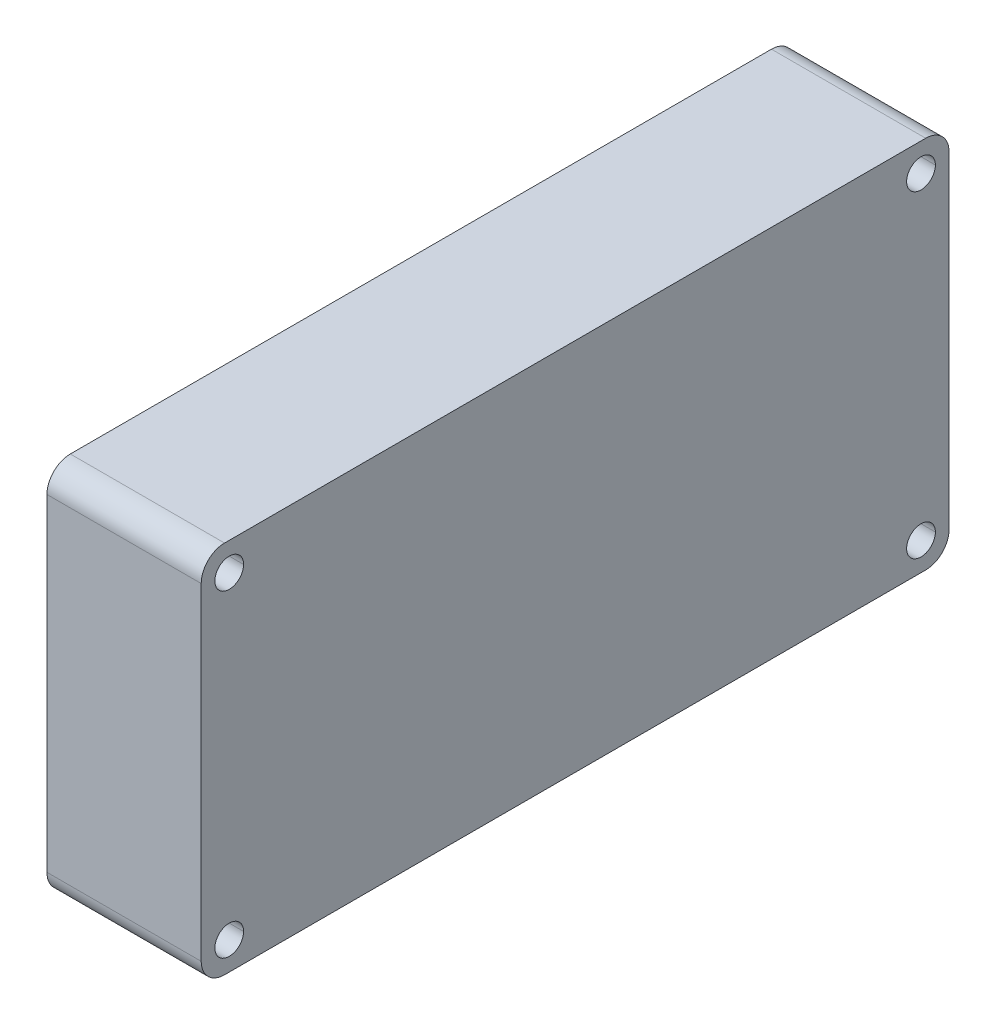
ISO-10303-21;
HEADER;
FILE_DESCRIPTION(('STEP AP214'),'2;1');
FILE_NAME('part.step','',(''),(''),'','','');
FILE_SCHEMA(('AUTOMOTIVE_DESIGN { 1 0 10303 214 1 1 1 1 }'));
ENDSEC;
DATA;
#1=APPLICATION_CONTEXT('core data for automotive mechanical design processes');
#2=APPLICATION_PROTOCOL_DEFINITION('international standard','automotive_design',2000,#1);
#3=PRODUCT_CONTEXT('',#1,'mechanical');
#4=PRODUCT('Part','Part','',(#3));
#5=PRODUCT_RELATED_PRODUCT_CATEGORY('part','',(#4));
#6=PRODUCT_DEFINITION_FORMATION('','',#4);
#7=PRODUCT_DEFINITION_CONTEXT('part definition',#1,'design');
#8=PRODUCT_DEFINITION('design','',#6,#7);
#9=PRODUCT_DEFINITION_SHAPE('','',#8);
#10=(LENGTH_UNIT() NAMED_UNIT(*) SI_UNIT(.MILLI.,.METRE.));
#11=(NAMED_UNIT(*) PLANE_ANGLE_UNIT() SI_UNIT($,.RADIAN.));
#12=(NAMED_UNIT(*) SI_UNIT($,.STERADIAN.) SOLID_ANGLE_UNIT());
#13=UNCERTAINTY_MEASURE_WITH_UNIT(LENGTH_MEASURE(1.E-05),#10,'distance_accuracy_value','');
#14=(GEOMETRIC_REPRESENTATION_CONTEXT(3) GLOBAL_UNCERTAINTY_ASSIGNED_CONTEXT((#13)) GLOBAL_UNIT_ASSIGNED_CONTEXT((#10,
#11,#12)) REPRESENTATION_CONTEXT('',''));
#15=CARTESIAN_POINT('',(0.,0.,0.));
#16=DIRECTION('',(0.,0.,1.));
#17=DIRECTION('',(1.,0.,0.));
#18=AXIS2_PLACEMENT_3D('',#15,#16,#17);
#19=CARTESIAN_POINT('',(0.,33.9999999999996,74.));
#20=DIRECTION('',(1.,0.,0.));
#21=DIRECTION('',(0.,0.,-1.));
#22=AXIS2_PLACEMENT_3D('',#19,#20,#21);
#23=CYLINDRICAL_SURFACE('',#22,3.075);
#24=DIRECTION('',(1.,0.,0.));
#25=VECTOR('',#24,1.);
#26=CARTESIAN_POINT('',(0.,33.9999999999996,77.075));
#27=LINE('',#26,#25);
#28=CARTESIAN_POINT('',(0.,33.9999999999996,77.075));
#29=VERTEX_POINT('',#28);
#30=CARTESIAN_POINT('',(33.,33.9999999999996,77.075));
#31=VERTEX_POINT('',#30);
#32=EDGE_CURVE('E147',#29,#31,#27,.T.);
#33=ORIENTED_EDGE('',*,*,#32,.F.);
#34=CARTESIAN_POINT('',(0.,33.9999999999996,74.));
#35=DIRECTION('',(1.,0.,0.));
#36=DIRECTION('',(0.,0.,1.));
#37=AXIS2_PLACEMENT_3D('',#34,#35,#36);
#38=CIRCLE('',#37,3.075);
#39=CARTESIAN_POINT('',(0.,33.9999999999996,70.925));
#40=VERTEX_POINT('',#39);
#41=EDGE_CURVE('E142',#40,#29,#38,.T.);
#42=ORIENTED_EDGE('',*,*,#41,.F.);
#43=DIRECTION('',(1.,0.,0.));
#44=VECTOR('',#43,1.);
#45=CARTESIAN_POINT('',(0.,33.9999999999996,70.925));
#46=LINE('',#45,#44);
#47=CARTESIAN_POINT('',(33.,33.9999999999996,70.925));
#48=VERTEX_POINT('',#47);
#49=EDGE_CURVE('E144',#40,#48,#46,.T.);
#50=ORIENTED_EDGE('',*,*,#49,.T.);
#51=CARTESIAN_POINT('',(33.,33.9999999999996,74.));
#52=DIRECTION('',(1.,0.,0.));
#53=DIRECTION('',(0.,0.,1.));
#54=AXIS2_PLACEMENT_3D('',#51,#52,#53);
#55=CIRCLE('',#54,3.075);
#56=EDGE_CURVE('E242',#48,#31,#55,.T.);
#57=ORIENTED_EDGE('',*,*,#56,.T.);
#58=EDGE_LOOP('',(#33,#42,#50,#57));
#59=FACE_BOUND('',#58,.T.);
#60=ADVANCED_FACE('F17',(#59),#23,.F.);
#61=CARTESIAN_POINT('',(0.,-34.,-74.));
#62=DIRECTION('',(1.,0.,0.));
#63=DIRECTION('',(0.,0.,-1.));
#64=AXIS2_PLACEMENT_3D('',#61,#62,#63);
#65=CYLINDRICAL_SURFACE('',#64,3.075);
#66=DIRECTION('',(1.,0.,0.));
#67=VECTOR('',#66,1.);
#68=CARTESIAN_POINT('',(0.,-34.,-70.925));
#69=LINE('',#68,#67);
#70=CARTESIAN_POINT('',(0.,-34.,-70.925));
#71=VERTEX_POINT('',#70);
#72=CARTESIAN_POINT('',(33.,-34.,-70.925));
#73=VERTEX_POINT('',#72);
#74=EDGE_CURVE('E227',#71,#73,#69,.T.);
#75=ORIENTED_EDGE('',*,*,#74,.F.);
#76=CARTESIAN_POINT('',(0.,-34.,-74.));
#77=DIRECTION('',(1.,0.,0.));
#78=DIRECTION('',(0.,0.,1.));
#79=AXIS2_PLACEMENT_3D('',#76,#77,#78);
#80=CIRCLE('',#79,3.075);
#81=CARTESIAN_POINT('',(0.,-34.,-77.075));
#82=VERTEX_POINT('',#81);
#83=EDGE_CURVE('E152',#82,#71,#80,.T.);
#84=ORIENTED_EDGE('',*,*,#83,.F.);
#85=DIRECTION('',(1.,0.,0.));
#86=VECTOR('',#85,1.);
#87=CARTESIAN_POINT('',(0.,-34.,-77.075));
#88=LINE('',#87,#86);
#89=CARTESIAN_POINT('',(33.,-34.,-77.075));
#90=VERTEX_POINT('',#89);
#91=EDGE_CURVE('E202',#82,#90,#88,.T.);
#92=ORIENTED_EDGE('',*,*,#91,.T.);
#93=CARTESIAN_POINT('',(33.,-34.,-74.));
#94=DIRECTION('',(1.,0.,0.));
#95=DIRECTION('',(0.,0.,1.));
#96=AXIS2_PLACEMENT_3D('',#93,#94,#95);
#97=CIRCLE('',#96,3.075);
#98=EDGE_CURVE('E219',#90,#73,#97,.T.);
#99=ORIENTED_EDGE('',*,*,#98,.T.);
#100=EDGE_LOOP('',(#75,#84,#92,#99));
#101=FACE_BOUND('',#100,.T.);
#102=ADVANCED_FACE('F264',(#101),#65,.F.);
#103=CARTESIAN_POINT('',(0.,-33.9999999999996,74.));
#104=DIRECTION('',(1.,0.,0.));
#105=DIRECTION('',(0.,0.,-1.));
#106=AXIS2_PLACEMENT_3D('',#103,#104,#105);
#107=CYLINDRICAL_SURFACE('',#106,3.075);
#108=DIRECTION('',(1.,0.,0.));
#109=VECTOR('',#108,1.);
#110=CARTESIAN_POINT('',(0.,-33.9999999999996,77.075));
#111=LINE('',#110,#109);
#112=CARTESIAN_POINT('',(0.,-33.9999999999996,77.075));
#113=VERTEX_POINT('',#112);
#114=CARTESIAN_POINT('',(33.,-33.9999999999996,77.075));
#115=VERTEX_POINT('',#114);
#116=EDGE_CURVE('E201',#113,#115,#111,.T.);
#117=ORIENTED_EDGE('',*,*,#116,.F.);
#118=CARTESIAN_POINT('',(0.,-33.9999999999996,74.));
#119=DIRECTION('',(1.,0.,0.));
#120=DIRECTION('',(0.,0.,-1.));
#121=AXIS2_PLACEMENT_3D('',#118,#119,#120);
#122=CIRCLE('',#121,3.075);
#123=CARTESIAN_POINT('',(0.,-33.9999999999996,70.925));
#124=VERTEX_POINT('',#123);
#125=EDGE_CURVE('E196',#124,#113,#122,.T.);
#126=ORIENTED_EDGE('',*,*,#125,.F.);
#127=DIRECTION('',(1.,0.,0.));
#128=VECTOR('',#127,1.);
#129=CARTESIAN_POINT('',(0.,-33.9999999999996,70.925));
#130=LINE('',#129,#128);
#131=CARTESIAN_POINT('',(33.,-33.9999999999996,70.925));
#132=VERTEX_POINT('',#131);
#133=EDGE_CURVE('E188',#124,#132,#130,.T.);
#134=ORIENTED_EDGE('',*,*,#133,.T.);
#135=CARTESIAN_POINT('',(33.,-33.9999999999996,74.));
#136=DIRECTION('',(1.,0.,0.));
#137=DIRECTION('',(0.,0.,-1.));
#138=AXIS2_PLACEMENT_3D('',#135,#136,#137);
#139=CIRCLE('',#138,3.075);
#140=EDGE_CURVE('E215',#132,#115,#139,.T.);
#141=ORIENTED_EDGE('',*,*,#140,.T.);
#142=EDGE_LOOP('',(#117,#126,#134,#141));
#143=FACE_BOUND('',#142,.T.);
#144=ADVANCED_FACE('F592',(#143),#107,.F.);
#145=CARTESIAN_POINT('',(0.,34.,-74.));
#146=DIRECTION('',(1.,0.,0.));
#147=DIRECTION('',(0.,0.,-1.));
#148=AXIS2_PLACEMENT_3D('',#145,#146,#147);
#149=CYLINDRICAL_SURFACE('',#148,3.075);
#150=DIRECTION('',(1.,0.,0.));
#151=VECTOR('',#150,1.);
#152=CARTESIAN_POINT('',(0.,34.,-70.925));
#153=LINE('',#152,#151);
#154=CARTESIAN_POINT('',(0.,34.,-70.925));
#155=VERTEX_POINT('',#154);
#156=CARTESIAN_POINT('',(33.,34.,-70.925));
#157=VERTEX_POINT('',#156);
#158=EDGE_CURVE('E253',#155,#157,#153,.T.);
#159=ORIENTED_EDGE('',*,*,#158,.F.);
#160=CARTESIAN_POINT('',(0.,34.,-74.));
#161=DIRECTION('',(1.,0.,0.));
#162=DIRECTION('',(0.,0.,-1.));
#163=AXIS2_PLACEMENT_3D('',#160,#161,#162);
#164=CIRCLE('',#163,3.075);
#165=CARTESIAN_POINT('',(0.,34.,-77.075));
#166=VERTEX_POINT('',#165);
#167=EDGE_CURVE('E214',#166,#155,#164,.T.);
#168=ORIENTED_EDGE('',*,*,#167,.F.);
#169=DIRECTION('',(1.,0.,0.));
#170=VECTOR('',#169,1.);
#171=CARTESIAN_POINT('',(0.,34.,-77.075));
#172=LINE('',#171,#170);
#173=CARTESIAN_POINT('',(33.,34.,-77.075));
#174=VERTEX_POINT('',#173);
#175=EDGE_CURVE('E182',#166,#174,#172,.T.);
#176=ORIENTED_EDGE('',*,*,#175,.T.);
#177=CARTESIAN_POINT('',(33.,34.,-74.));
#178=DIRECTION('',(1.,0.,0.));
#179=DIRECTION('',(0.,0.,-1.));
#180=AXIS2_PLACEMENT_3D('',#177,#178,#179);
#181=CIRCLE('',#180,3.075);
#182=EDGE_CURVE('E218',#174,#157,#181,.T.);
#183=ORIENTED_EDGE('',*,*,#182,.T.);
#184=EDGE_LOOP('',(#159,#168,#176,#183));
#185=FACE_BOUND('',#184,.T.);
#186=ADVANCED_FACE('F624',(#185),#149,.F.);
#187=CARTESIAN_POINT('',(33.,-35.,80.));
#188=DIRECTION('',(0.,0.,-1.));
#189=DIRECTION('',(0.,-1.,0.));
#190=AXIS2_PLACEMENT_3D('',#187,#188,#189);
#191=PLANE('',#190);
#192=DIRECTION('',(0.,-1.,0.));
#193=VECTOR('',#192,1.);
#194=CARTESIAN_POINT('',(0.,-35.,80.));
#195=LINE('',#194,#193);
#196=CARTESIAN_POINT('',(0.,35.,80.));
#197=VERTEX_POINT('',#196);
#198=CARTESIAN_POINT('',(0.,-35.,80.));
#199=VERTEX_POINT('',#198);
#200=EDGE_CURVE('E223',#197,#199,#195,.T.);
#201=ORIENTED_EDGE('',*,*,#200,.T.);
#202=DIRECTION('',(-1.,0.,0.));
#203=VECTOR('',#202,1.);
#204=CARTESIAN_POINT('',(33.,-35.,80.));
#205=LINE('',#204,#203);
#206=CARTESIAN_POINT('',(33.,-35.,80.));
#207=VERTEX_POINT('',#206);
#208=EDGE_CURVE('E213',#207,#199,#205,.T.);
#209=ORIENTED_EDGE('',*,*,#208,.F.);
#210=DIRECTION('',(0.,-1.,0.));
#211=VECTOR('',#210,1.);
#212=CARTESIAN_POINT('',(33.,-35.,80.));
#213=LINE('',#212,#211);
#214=CARTESIAN_POINT('',(33.,35.,80.));
#215=VERTEX_POINT('',#214);
#216=EDGE_CURVE('E245',#215,#207,#213,.T.);
#217=ORIENTED_EDGE('',*,*,#216,.F.);
#218=DIRECTION('',(-1.,0.,0.));
#219=VECTOR('',#218,1.);
#220=CARTESIAN_POINT('',(33.,35.,80.));
#221=LINE('',#220,#219);
#222=EDGE_CURVE('E11',#215,#197,#221,.T.);
#223=ORIENTED_EDGE('',*,*,#222,.T.);
#224=EDGE_LOOP('',(#201,#209,#217,#223));
#225=FACE_BOUND('',#224,.T.);
#226=ADVANCED_FACE('F620',(#225),#191,.F.);
#227=CARTESIAN_POINT('',(33.,35.,75.));
#228=DIRECTION('',(-1.,0.,0.));
#229=DIRECTION('',(0.,0.,1.));
#230=AXIS2_PLACEMENT_3D('',#227,#228,#229);
#231=CYLINDRICAL_SURFACE('',#230,5.);
#232=CARTESIAN_POINT('',(0.,35.,75.));
#233=DIRECTION('',(1.,0.,0.));
#234=DIRECTION('',(0.,0.,1.));
#235=AXIS2_PLACEMENT_3D('',#232,#233,#234);
#236=CIRCLE('',#235,5.);
#237=CARTESIAN_POINT('',(0.,40.,75.));
#238=VERTEX_POINT('',#237);
#239=EDGE_CURVE('E181',#238,#197,#236,.T.);
#240=ORIENTED_EDGE('',*,*,#239,.T.);
#241=ORIENTED_EDGE('',*,*,#222,.F.);
#242=CARTESIAN_POINT('',(33.,35.,75.));
#243=DIRECTION('',(1.,0.,0.));
#244=DIRECTION('',(0.,0.,1.));
#245=AXIS2_PLACEMENT_3D('',#242,#243,#244);
#246=CIRCLE('',#245,5.);
#247=CARTESIAN_POINT('',(33.,40.,75.));
#248=VERTEX_POINT('',#247);
#249=EDGE_CURVE('E246',#248,#215,#246,.T.);
#250=ORIENTED_EDGE('',*,*,#249,.F.);
#251=DIRECTION('',(-1.,0.,0.));
#252=VECTOR('',#251,1.);
#253=CARTESIAN_POINT('',(33.,40.,75.));
#254=LINE('',#253,#252);
#255=EDGE_CURVE('E28',#248,#238,#254,.T.);
#256=ORIENTED_EDGE('',*,*,#255,.T.);
#257=EDGE_LOOP('',(#240,#241,#250,#256));
#258=FACE_BOUND('',#257,.T.);
#259=ADVANCED_FACE('F352',(#258),#231,.T.);
#260=CARTESIAN_POINT('',(33.,40.,75.));
#261=DIRECTION('',(0.,-1.,0.));
#262=DIRECTION('',(0.,0.,-1.));
#263=AXIS2_PLACEMENT_3D('',#260,#261,#262);
#264=PLANE('',#263);
#265=DIRECTION('',(0.,0.,1.));
#266=VECTOR('',#265,1.);
#267=CARTESIAN_POINT('',(0.,40.,75.));
#268=LINE('',#267,#266);
#269=CARTESIAN_POINT('',(0.,40.,-75.));
#270=VERTEX_POINT('',#269);
#271=EDGE_CURVE('E176',#270,#238,#268,.T.);
#272=ORIENTED_EDGE('',*,*,#271,.T.);
#273=ORIENTED_EDGE('',*,*,#255,.F.);
#274=DIRECTION('',(0.,0.,1.));
#275=VECTOR('',#274,1.);
#276=CARTESIAN_POINT('',(33.,40.,75.));
#277=LINE('',#276,#275);
#278=CARTESIAN_POINT('',(33.,40.,-75.));
#279=VERTEX_POINT('',#278);
#280=EDGE_CURVE('E21',#279,#248,#277,.T.);
#281=ORIENTED_EDGE('',*,*,#280,.F.);
#282=DIRECTION('',(-1.,0.,0.));
#283=VECTOR('',#282,1.);
#284=CARTESIAN_POINT('',(33.,40.,-75.));
#285=LINE('',#284,#283);
#286=EDGE_CURVE('E328',#279,#270,#285,.T.);
#287=ORIENTED_EDGE('',*,*,#286,.T.);
#288=EDGE_LOOP('',(#272,#273,#281,#287));
#289=FACE_BOUND('',#288,.T.);
#290=ADVANCED_FACE('F338',(#289),#264,.F.);
#291=CARTESIAN_POINT('',(33.,35.,-75.));
#292=DIRECTION('',(-1.,0.,0.));
#293=DIRECTION('',(0.,0.,1.));
#294=AXIS2_PLACEMENT_3D('',#291,#292,#293);
#295=CYLINDRICAL_SURFACE('',#294,5.);
#296=CARTESIAN_POINT('',(0.,35.,-75.));
#297=DIRECTION('',(1.,0.,0.));
#298=DIRECTION('',(0.,0.,1.));
#299=AXIS2_PLACEMENT_3D('',#296,#297,#298);
#300=CIRCLE('',#299,5.);
#301=CARTESIAN_POINT('',(0.,35.,-80.));
#302=VERTEX_POINT('',#301);
#303=EDGE_CURVE('E180',#302,#270,#300,.T.);
#304=ORIENTED_EDGE('',*,*,#303,.T.);
#305=ORIENTED_EDGE('',*,*,#286,.F.);
#306=CARTESIAN_POINT('',(33.,35.,-75.));
#307=DIRECTION('',(1.,0.,0.));
#308=DIRECTION('',(0.,0.,1.));
#309=AXIS2_PLACEMENT_3D('',#306,#307,#308);
#310=CIRCLE('',#309,5.);
#311=CARTESIAN_POINT('',(33.,35.,-80.));
#312=VERTEX_POINT('',#311);
#313=EDGE_CURVE('E305',#312,#279,#310,.T.);
#314=ORIENTED_EDGE('',*,*,#313,.F.);
#315=DIRECTION('',(-1.,0.,0.));
#316=VECTOR('',#315,1.);
#317=CARTESIAN_POINT('',(33.,35.,-80.));
#318=LINE('',#317,#316);
#319=EDGE_CURVE('E324',#312,#302,#318,.T.);
#320=ORIENTED_EDGE('',*,*,#319,.T.);
#321=EDGE_LOOP('',(#304,#305,#314,#320));
#322=FACE_BOUND('',#321,.T.);
#323=ADVANCED_FACE('F345',(#322),#295,.T.);
#324=CARTESIAN_POINT('',(33.,-35.,-80.));
#325=DIRECTION('',(0.,0.,1.));
#326=DIRECTION('',(1.,0.,0.));
#327=AXIS2_PLACEMENT_3D('',#324,#325,#326);
#328=PLANE('',#327);
#329=DIRECTION('',(0.,1.,0.));
#330=VECTOR('',#329,1.);
#331=CARTESIAN_POINT('',(0.,-35.,-80.));
#332=LINE('',#331,#330);
#333=CARTESIAN_POINT('',(0.,-35.,-80.));
#334=VERTEX_POINT('',#333);
#335=EDGE_CURVE('E206',#334,#302,#332,.T.);
#336=ORIENTED_EDGE('',*,*,#335,.T.);
#337=ORIENTED_EDGE('',*,*,#319,.F.);
#338=DIRECTION('',(0.,1.,0.));
#339=VECTOR('',#338,1.);
#340=CARTESIAN_POINT('',(33.,-35.,-80.));
#341=LINE('',#340,#339);
#342=CARTESIAN_POINT('',(33.,-35.,-80.));
#343=VERTEX_POINT('',#342);
#344=EDGE_CURVE('E309',#343,#312,#341,.T.);
#345=ORIENTED_EDGE('',*,*,#344,.F.);
#346=DIRECTION('',(-1.,0.,0.));
#347=VECTOR('',#346,1.);
#348=CARTESIAN_POINT('',(33.,-35.,-80.));
#349=LINE('',#348,#347);
#350=EDGE_CURVE('E321',#343,#334,#349,.T.);
#351=ORIENTED_EDGE('',*,*,#350,.T.);
#352=EDGE_LOOP('',(#336,#337,#345,#351));
#353=FACE_BOUND('',#352,.T.);
#354=ADVANCED_FACE('F633',(#353),#328,.F.);
#355=CARTESIAN_POINT('',(33.,-35.,-75.));
#356=DIRECTION('',(-1.,0.,0.));
#357=DIRECTION('',(0.,0.,1.));
#358=AXIS2_PLACEMENT_3D('',#355,#356,#357);
#359=CYLINDRICAL_SURFACE('',#358,5.);
#360=CARTESIAN_POINT('',(0.,-35.,-75.));
#361=DIRECTION('',(1.,0.,0.));
#362=DIRECTION('',(0.,0.,-1.));
#363=AXIS2_PLACEMENT_3D('',#360,#361,#362);
#364=CIRCLE('',#363,5.);
#365=CARTESIAN_POINT('',(0.,-40.,-75.));
#366=VERTEX_POINT('',#365);
#367=EDGE_CURVE('E209',#366,#334,#364,.T.);
#368=ORIENTED_EDGE('',*,*,#367,.T.);
#369=ORIENTED_EDGE('',*,*,#350,.F.);
#370=CARTESIAN_POINT('',(33.,-35.,-75.));
#371=DIRECTION('',(1.,0.,0.));
#372=DIRECTION('',(0.,0.,-1.));
#373=AXIS2_PLACEMENT_3D('',#370,#371,#372);
#374=CIRCLE('',#373,5.);
#375=CARTESIAN_POINT('',(33.,-40.,-75.));
#376=VERTEX_POINT('',#375);
#377=EDGE_CURVE('E174',#376,#343,#374,.T.);
#378=ORIENTED_EDGE('',*,*,#377,.F.);
#379=DIRECTION('',(-1.,0.,0.));
#380=VECTOR('',#379,1.);
#381=CARTESIAN_POINT('',(33.,-40.,-75.));
#382=LINE('',#381,#380);
#383=EDGE_CURVE('E43',#376,#366,#382,.T.);
#384=ORIENTED_EDGE('',*,*,#383,.T.);
#385=EDGE_LOOP('',(#368,#369,#378,#384));
#386=FACE_BOUND('',#385,.T.);
#387=ADVANCED_FACE('F583',(#386),#359,.T.);
#388=CARTESIAN_POINT('',(33.,-40.,75.));
#389=DIRECTION('',(0.,1.,0.));
#390=DIRECTION('',(1.,0.,0.));
#391=AXIS2_PLACEMENT_3D('',#388,#389,#390);
#392=PLANE('',#391);
#393=DIRECTION('',(0.,0.,-1.));
#394=VECTOR('',#393,1.);
#395=CARTESIAN_POINT('',(0.,-40.,75.));
#396=LINE('',#395,#394);
#397=CARTESIAN_POINT('',(0.,-40.,75.));
#398=VERTEX_POINT('',#397);
#399=EDGE_CURVE('E153',#398,#366,#396,.T.);
#400=ORIENTED_EDGE('',*,*,#399,.T.);
#401=ORIENTED_EDGE('',*,*,#383,.F.);
#402=DIRECTION('',(0.,0.,-1.));
#403=VECTOR('',#402,1.);
#404=CARTESIAN_POINT('',(33.,-40.,75.));
#405=LINE('',#404,#403);
#406=CARTESIAN_POINT('',(33.,-40.,75.));
#407=VERTEX_POINT('',#406);
#408=EDGE_CURVE('E292',#407,#376,#405,.T.);
#409=ORIENTED_EDGE('',*,*,#408,.F.);
#410=DIRECTION('',(-1.,0.,0.));
#411=VECTOR('',#410,1.);
#412=CARTESIAN_POINT('',(33.,-40.,75.));
#413=LINE('',#412,#411);
#414=EDGE_CURVE('E210',#407,#398,#413,.T.);
#415=ORIENTED_EDGE('',*,*,#414,.T.);
#416=EDGE_LOOP('',(#400,#401,#409,#415));
#417=FACE_BOUND('',#416,.T.);
#418=ADVANCED_FACE('F578',(#417),#392,.F.);
#419=CARTESIAN_POINT('',(33.,-35.,75.));
#420=DIRECTION('',(-1.,0.,0.));
#421=DIRECTION('',(0.,0.,1.));
#422=AXIS2_PLACEMENT_3D('',#419,#420,#421);
#423=CYLINDRICAL_SURFACE('',#422,5.);
#424=CARTESIAN_POINT('',(0.,-35.,75.));
#425=DIRECTION('',(1.,0.,0.));
#426=DIRECTION('',(0.,0.,1.));
#427=AXIS2_PLACEMENT_3D('',#424,#425,#426);
#428=CIRCLE('',#427,5.);
#429=EDGE_CURVE('E296',#199,#398,#428,.T.);
#430=ORIENTED_EDGE('',*,*,#429,.T.);
#431=ORIENTED_EDGE('',*,*,#414,.F.);
#432=CARTESIAN_POINT('',(33.,-35.,75.));
#433=DIRECTION('',(1.,0.,0.));
#434=DIRECTION('',(0.,0.,1.));
#435=AXIS2_PLACEMENT_3D('',#432,#433,#434);
#436=CIRCLE('',#435,5.);
#437=EDGE_CURVE('E186',#207,#407,#436,.T.);
#438=ORIENTED_EDGE('',*,*,#437,.F.);
#439=ORIENTED_EDGE('',*,*,#208,.T.);
#440=EDGE_LOOP('',(#430,#431,#438,#439));
#441=FACE_BOUND('',#440,.T.);
#442=ADVANCED_FACE('F582',(#441),#423,.T.);
#443=CARTESIAN_POINT('',(0.,-35.,75.));
#444=DIRECTION('',(-1.,0.,0.));
#445=DIRECTION('',(0.,0.,1.));
#446=AXIS2_PLACEMENT_3D('',#443,#444,#445);
#447=PLANE('',#446);
#448=ORIENTED_EDGE('',*,*,#167,.T.);
#449=CARTESIAN_POINT('',(0.,34.,-74.));
#450=DIRECTION('',(1.,0.,0.));
#451=DIRECTION('',(0.,0.,-1.));
#452=AXIS2_PLACEMENT_3D('',#449,#450,#451);
#453=CIRCLE('',#452,3.075);
#454=EDGE_CURVE('E191',#155,#166,#453,.T.);
#455=ORIENTED_EDGE('',*,*,#454,.T.);
#456=EDGE_LOOP('',(#448,#455));
#457=FACE_BOUND('',#456,.T.);
#458=ORIENTED_EDGE('',*,*,#125,.T.);
#459=CARTESIAN_POINT('',(0.,-33.9999999999996,74.));
#460=DIRECTION('',(1.,0.,0.));
#461=DIRECTION('',(0.,0.,-1.));
#462=AXIS2_PLACEMENT_3D('',#459,#460,#461);
#463=CIRCLE('',#462,3.075);
#464=EDGE_CURVE('E197',#113,#124,#463,.T.);
#465=ORIENTED_EDGE('',*,*,#464,.T.);
#466=EDGE_LOOP('',(#458,#465));
#467=FACE_BOUND('',#466,.T.);
#468=ORIENTED_EDGE('',*,*,#83,.T.);
#469=CARTESIAN_POINT('',(0.,-34.,-74.));
#470=DIRECTION('',(1.,0.,0.));
#471=DIRECTION('',(0.,0.,1.));
#472=AXIS2_PLACEMENT_3D('',#469,#470,#471);
#473=CIRCLE('',#472,3.075);
#474=EDGE_CURVE('E161',#71,#82,#473,.T.);
#475=ORIENTED_EDGE('',*,*,#474,.T.);
#476=EDGE_LOOP('',(#468,#475));
#477=FACE_BOUND('',#476,.T.);
#478=ORIENTED_EDGE('',*,*,#41,.T.);
#479=CARTESIAN_POINT('',(0.,33.9999999999996,74.));
#480=DIRECTION('',(1.,0.,0.));
#481=DIRECTION('',(0.,0.,1.));
#482=AXIS2_PLACEMENT_3D('',#479,#480,#481);
#483=CIRCLE('',#482,3.075);
#484=EDGE_CURVE('E157',#29,#40,#483,.T.);
#485=ORIENTED_EDGE('',*,*,#484,.T.);
#486=EDGE_LOOP('',(#478,#485));
#487=FACE_BOUND('',#486,.T.);
#488=ORIENTED_EDGE('',*,*,#429,.F.);
#489=ORIENTED_EDGE('',*,*,#200,.F.);
#490=ORIENTED_EDGE('',*,*,#239,.F.);
#491=ORIENTED_EDGE('',*,*,#271,.F.);
#492=ORIENTED_EDGE('',*,*,#303,.F.);
#493=ORIENTED_EDGE('',*,*,#335,.F.);
#494=ORIENTED_EDGE('',*,*,#367,.F.);
#495=ORIENTED_EDGE('',*,*,#399,.F.);
#496=EDGE_LOOP('',(#488,#489,#490,#491,#492,#493,#494,#495));
#497=FACE_BOUND('',#496,.T.);
#498=ADVANCED_FACE('F163',(#457,#467,#477,#487,#497),#447,.T.);
#499=CARTESIAN_POINT('',(33.,-35.,75.));
#500=DIRECTION('',(-1.,0.,0.));
#501=DIRECTION('',(0.,0.,1.));
#502=AXIS2_PLACEMENT_3D('',#499,#500,#501);
#503=PLANE('',#502);
#504=ORIENTED_EDGE('',*,*,#182,.F.);
#505=CARTESIAN_POINT('',(33.,34.,-74.));
#506=DIRECTION('',(1.,0.,0.));
#507=DIRECTION('',(0.,0.,-1.));
#508=AXIS2_PLACEMENT_3D('',#505,#506,#507);
#509=CIRCLE('',#508,3.075);
#510=EDGE_CURVE('E187',#157,#174,#509,.T.);
#511=ORIENTED_EDGE('',*,*,#510,.F.);
#512=EDGE_LOOP('',(#504,#511));
#513=FACE_BOUND('',#512,.T.);
#514=ORIENTED_EDGE('',*,*,#140,.F.);
#515=CARTESIAN_POINT('',(33.,-33.9999999999996,74.));
#516=DIRECTION('',(1.,0.,0.));
#517=DIRECTION('',(0.,0.,-1.));
#518=AXIS2_PLACEMENT_3D('',#515,#516,#517);
#519=CIRCLE('',#518,3.075);
#520=EDGE_CURVE('E192',#115,#132,#519,.T.);
#521=ORIENTED_EDGE('',*,*,#520,.F.);
#522=EDGE_LOOP('',(#514,#521));
#523=FACE_BOUND('',#522,.T.);
#524=ORIENTED_EDGE('',*,*,#98,.F.);
#525=CARTESIAN_POINT('',(33.,-34.,-74.));
#526=DIRECTION('',(1.,0.,0.));
#527=DIRECTION('',(0.,0.,1.));
#528=AXIS2_PLACEMENT_3D('',#525,#526,#527);
#529=CIRCLE('',#528,3.075);
#530=EDGE_CURVE('E224',#73,#90,#529,.T.);
#531=ORIENTED_EDGE('',*,*,#530,.F.);
#532=EDGE_LOOP('',(#524,#531));
#533=FACE_BOUND('',#532,.T.);
#534=ORIENTED_EDGE('',*,*,#56,.F.);
#535=CARTESIAN_POINT('',(33.,33.9999999999996,74.));
#536=DIRECTION('',(1.,0.,0.));
#537=DIRECTION('',(0.,0.,1.));
#538=AXIS2_PLACEMENT_3D('',#535,#536,#537);
#539=CIRCLE('',#538,3.075);
#540=EDGE_CURVE('E159',#31,#48,#539,.T.);
#541=ORIENTED_EDGE('',*,*,#540,.F.);
#542=EDGE_LOOP('',(#534,#541));
#543=FACE_BOUND('',#542,.T.);
#544=ORIENTED_EDGE('',*,*,#437,.T.);
#545=ORIENTED_EDGE('',*,*,#408,.T.);
#546=ORIENTED_EDGE('',*,*,#377,.T.);
#547=ORIENTED_EDGE('',*,*,#344,.T.);
#548=ORIENTED_EDGE('',*,*,#313,.T.);
#549=ORIENTED_EDGE('',*,*,#280,.T.);
#550=ORIENTED_EDGE('',*,*,#249,.T.);
#551=ORIENTED_EDGE('',*,*,#216,.T.);
#552=EDGE_LOOP('',(#544,#545,#546,#547,#548,#549,#550,#551));
#553=FACE_BOUND('',#552,.T.);
#554=ADVANCED_FACE('F19',(#513,#523,#533,#543,#553),#503,.F.);
#555=CARTESIAN_POINT('',(0.,34.,-74.));
#556=DIRECTION('',(1.,0.,0.));
#557=DIRECTION('',(0.,0.,-1.));
#558=AXIS2_PLACEMENT_3D('',#555,#556,#557);
#559=CYLINDRICAL_SURFACE('',#558,3.075);
#560=ORIENTED_EDGE('',*,*,#454,.F.);
#561=ORIENTED_EDGE('',*,*,#158,.T.);
#562=ORIENTED_EDGE('',*,*,#510,.T.);
#563=ORIENTED_EDGE('',*,*,#175,.F.);
#564=EDGE_LOOP('',(#560,#561,#562,#563));
#565=FACE_BOUND('',#564,.T.);
#566=ADVANCED_FACE('F597',(#565),#559,.F.);
#567=CARTESIAN_POINT('',(0.,-33.9999999999996,74.));
#568=DIRECTION('',(1.,0.,0.));
#569=DIRECTION('',(0.,0.,-1.));
#570=AXIS2_PLACEMENT_3D('',#567,#568,#569);
#571=CYLINDRICAL_SURFACE('',#570,3.075);
#572=ORIENTED_EDGE('',*,*,#464,.F.);
#573=ORIENTED_EDGE('',*,*,#116,.T.);
#574=ORIENTED_EDGE('',*,*,#520,.T.);
#575=ORIENTED_EDGE('',*,*,#133,.F.);
#576=EDGE_LOOP('',(#572,#573,#574,#575));
#577=FACE_BOUND('',#576,.T.);
#578=ADVANCED_FACE('F601',(#577),#571,.F.);
#579=CARTESIAN_POINT('',(0.,-34.,-74.));
#580=DIRECTION('',(1.,0.,0.));
#581=DIRECTION('',(0.,0.,-1.));
#582=AXIS2_PLACEMENT_3D('',#579,#580,#581);
#583=CYLINDRICAL_SURFACE('',#582,3.075);
#584=ORIENTED_EDGE('',*,*,#474,.F.);
#585=ORIENTED_EDGE('',*,*,#74,.T.);
#586=ORIENTED_EDGE('',*,*,#530,.T.);
#587=ORIENTED_EDGE('',*,*,#91,.F.);
#588=EDGE_LOOP('',(#584,#585,#586,#587));
#589=FACE_BOUND('',#588,.T.);
#590=ADVANCED_FACE('F272',(#589),#583,.F.);
#591=CARTESIAN_POINT('',(0.,33.9999999999996,74.));
#592=DIRECTION('',(1.,0.,0.));
#593=DIRECTION('',(0.,0.,-1.));
#594=AXIS2_PLACEMENT_3D('',#591,#592,#593);
#595=CYLINDRICAL_SURFACE('',#594,3.075);
#596=ORIENTED_EDGE('',*,*,#484,.F.);
#597=ORIENTED_EDGE('',*,*,#32,.T.);
#598=ORIENTED_EDGE('',*,*,#540,.T.);
#599=ORIENTED_EDGE('',*,*,#49,.F.);
#600=EDGE_LOOP('',(#596,#597,#598,#599));
#601=FACE_BOUND('',#600,.T.);
#602=ADVANCED_FACE('F156',(#601),#595,.F.);
#603=CLOSED_SHELL('',(#60,#102,#144,#186,#226,#259,#290,#323,#354,#387,#418,#442,#498,#554,#566,
#578,#590,#602));
#604=MANIFOLD_SOLID_BREP('B1',#603);
#605=ADVANCED_BREP_SHAPE_REPRESENTATION('',(#18,#604),#14);
#606=SHAPE_DEFINITION_REPRESENTATION(#9,#605);
ENDSEC;
END-ISO-10303-21;
